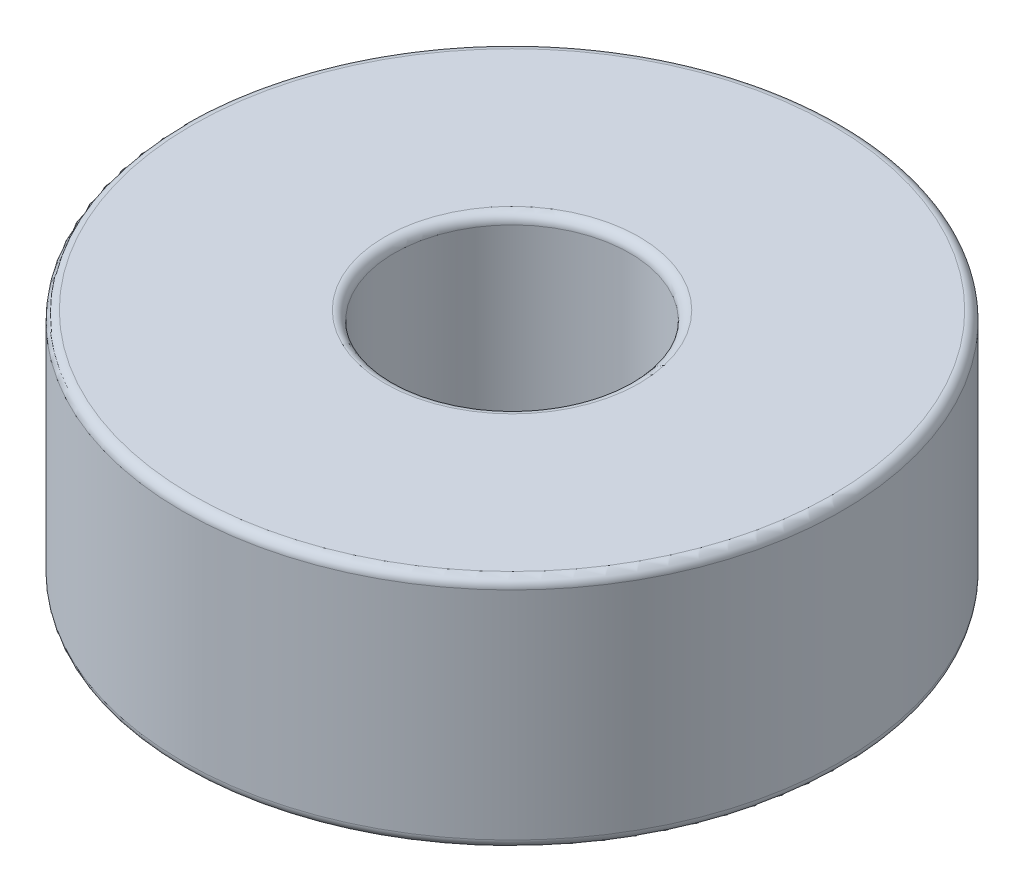
ISO-10303-21;
HEADER;
FILE_DESCRIPTION(('STEP AP214'),'2;1');
FILE_NAME('part.step','',(''),(''),'','','');
FILE_SCHEMA(('AUTOMOTIVE_DESIGN { 1 0 10303 214 1 1 1 1 }'));
ENDSEC;
DATA;
#1=APPLICATION_CONTEXT('core data for automotive mechanical design processes');
#2=APPLICATION_PROTOCOL_DEFINITION('international standard','automotive_design',2000,#1);
#3=PRODUCT_CONTEXT('',#1,'mechanical');
#4=PRODUCT('Part','Part','',(#3));
#5=PRODUCT_RELATED_PRODUCT_CATEGORY('part','',(#4));
#6=PRODUCT_DEFINITION_FORMATION('','',#4);
#7=PRODUCT_DEFINITION_CONTEXT('part definition',#1,'design');
#8=PRODUCT_DEFINITION('design','',#6,#7);
#9=PRODUCT_DEFINITION_SHAPE('','',#8);
#10=(LENGTH_UNIT() NAMED_UNIT(*) SI_UNIT(.MILLI.,.METRE.));
#11=(NAMED_UNIT(*) PLANE_ANGLE_UNIT() SI_UNIT($,.RADIAN.));
#12=(NAMED_UNIT(*) SI_UNIT($,.STERADIAN.) SOLID_ANGLE_UNIT());
#13=UNCERTAINTY_MEASURE_WITH_UNIT(LENGTH_MEASURE(1.E-05),#10,'distance_accuracy_value','');
#14=(GEOMETRIC_REPRESENTATION_CONTEXT(3) GLOBAL_UNCERTAINTY_ASSIGNED_CONTEXT((#13)) GLOBAL_UNIT_ASSIGNED_CONTEXT((#10,
#11,#12)) REPRESENTATION_CONTEXT('',''));
#15=CARTESIAN_POINT('',(0.,0.,0.));
#16=DIRECTION('',(0.,0.,1.));
#17=DIRECTION('',(1.,0.,0.));
#18=AXIS2_PLACEMENT_3D('',#15,#16,#17);
#19=CARTESIAN_POINT('',(0.,2.5,0.));
#20=DIRECTION('',(0.,1.,0.));
#21=DIRECTION('',(0.,0.,1.));
#22=AXIS2_PLACEMENT_3D('',#19,#20,#21);
#23=PLANE('',#22);
#24=CARTESIAN_POINT('',(0.,2.5,0.));
#25=DIRECTION('',(0.,1.,0.));
#26=DIRECTION('',(0.,0.,1.));
#27=AXIS2_PLACEMENT_3D('',#24,#25,#26);
#28=CIRCLE('',#27,2.7);
#29=CARTESIAN_POINT('',(0.,2.5,2.7));
#30=VERTEX_POINT('',#29);
#31=EDGE_CURVE('E10',#30,#30,#28,.F.);
#32=ORIENTED_EDGE('',*,*,#31,.T.);
#33=EDGE_LOOP('',(#32));
#34=FACE_BOUND('',#33,.T.);
#35=CARTESIAN_POINT('',(0.,2.5,0.));
#36=DIRECTION('',(0.,1.,0.));
#37=DIRECTION('',(0.,0.,1.));
#38=AXIS2_PLACEMENT_3D('',#35,#36,#37);
#39=CIRCLE('',#38,6.8);
#40=CARTESIAN_POINT('',(0.,2.5,6.8));
#41=VERTEX_POINT('',#40);
#42=EDGE_CURVE('E45',#41,#41,#39,.T.);
#43=ORIENTED_EDGE('',*,*,#42,.T.);
#44=EDGE_LOOP('',(#43));
#45=FACE_BOUND('',#44,.T.);
#46=ADVANCED_FACE('F37',(#34,#45),#23,.T.);
#47=CARTESIAN_POINT('',(0.,-2.5,0.));
#48=DIRECTION('',(0.,1.,0.));
#49=DIRECTION('',(0.,0.,1.));
#50=AXIS2_PLACEMENT_3D('',#47,#48,#49);
#51=PLANE('',#50);
#52=CARTESIAN_POINT('',(0.,-2.5,0.));
#53=DIRECTION('',(0.,1.,0.));
#54=DIRECTION('',(0.,0.,1.));
#55=AXIS2_PLACEMENT_3D('',#52,#53,#54);
#56=CIRCLE('',#55,2.7);
#57=CARTESIAN_POINT('',(0.,-2.5,2.7));
#58=VERTEX_POINT('',#57);
#59=EDGE_CURVE('E69',#58,#58,#56,.T.);
#60=ORIENTED_EDGE('',*,*,#59,.T.);
#61=EDGE_LOOP('',(#60));
#62=FACE_BOUND('',#61,.T.);
#63=CARTESIAN_POINT('',(0.,-2.5,0.));
#64=DIRECTION('',(0.,1.,0.));
#65=DIRECTION('',(0.,0.,1.));
#66=AXIS2_PLACEMENT_3D('',#63,#64,#65);
#67=CIRCLE('',#66,6.8);
#68=CARTESIAN_POINT('',(0.,-2.5,6.8));
#69=VERTEX_POINT('',#68);
#70=EDGE_CURVE('E73',#69,#69,#67,.F.);
#71=ORIENTED_EDGE('',*,*,#70,.T.);
#72=EDGE_LOOP('',(#71));
#73=FACE_BOUND('',#72,.T.);
#74=ADVANCED_FACE('F78',(#62,#73),#51,.F.);
#75=CARTESIAN_POINT('',(0.,2.5,0.));
#76=DIRECTION('',(0.,-1.,0.));
#77=DIRECTION('',(0.,0.,-1.));
#78=AXIS2_PLACEMENT_3D('',#75,#76,#77);
#79=CYLINDRICAL_SURFACE('',#78,7.);
#80=CARTESIAN_POINT('',(0.,-2.3,0.));
#81=DIRECTION('',(0.,1.,0.));
#82=DIRECTION('',(0.,0.,1.));
#83=AXIS2_PLACEMENT_3D('',#80,#81,#82);
#84=CIRCLE('',#83,7.);
#85=CARTESIAN_POINT('',(0.,-2.3,7.));
#86=VERTEX_POINT('',#85);
#87=EDGE_CURVE('E50',#86,#86,#84,.T.);
#88=ORIENTED_EDGE('',*,*,#87,.T.);
#89=EDGE_LOOP('',(#88));
#90=FACE_BOUND('',#89,.T.);
#91=CARTESIAN_POINT('',(0.,2.3,0.));
#92=DIRECTION('',(0.,1.,0.));
#93=DIRECTION('',(0.,0.,1.));
#94=AXIS2_PLACEMENT_3D('',#91,#92,#93);
#95=CIRCLE('',#94,7.);
#96=CARTESIAN_POINT('',(0.,2.3,7.));
#97=VERTEX_POINT('',#96);
#98=EDGE_CURVE('E55',#97,#97,#95,.F.);
#99=ORIENTED_EDGE('',*,*,#98,.T.);
#100=EDGE_LOOP('',(#99));
#101=FACE_BOUND('',#100,.T.);
#102=ADVANCED_FACE('F88',(#90,#101),#79,.T.);
#103=CARTESIAN_POINT('',(0.,2.5,0.));
#104=DIRECTION('',(0.,-1.,0.));
#105=DIRECTION('',(0.,0.,-1.));
#106=AXIS2_PLACEMENT_3D('',#103,#104,#105);
#107=CYLINDRICAL_SURFACE('',#106,2.5);
#108=CARTESIAN_POINT('',(0.,-2.3,0.));
#109=DIRECTION('',(0.,1.,0.));
#110=DIRECTION('',(0.,0.,1.));
#111=AXIS2_PLACEMENT_3D('',#108,#109,#110);
#112=CIRCLE('',#111,2.5);
#113=CARTESIAN_POINT('',(0.,-2.3,2.5));
#114=VERTEX_POINT('',#113);
#115=EDGE_CURVE('E61',#114,#114,#112,.F.);
#116=ORIENTED_EDGE('',*,*,#115,.T.);
#117=EDGE_LOOP('',(#116));
#118=FACE_BOUND('',#117,.T.);
#119=CARTESIAN_POINT('',(0.,2.3,0.));
#120=DIRECTION('',(0.,1.,0.));
#121=DIRECTION('',(0.,0.,1.));
#122=AXIS2_PLACEMENT_3D('',#119,#120,#121);
#123=CIRCLE('',#122,2.5);
#124=CARTESIAN_POINT('',(0.,2.3,2.5));
#125=VERTEX_POINT('',#124);
#126=EDGE_CURVE('E65',#125,#125,#123,.T.);
#127=ORIENTED_EDGE('',*,*,#126,.T.);
#128=EDGE_LOOP('',(#127));
#129=FACE_BOUND('',#128,.T.);
#130=ADVANCED_FACE('F91',(#118,#129),#107,.F.);
#131=CARTESIAN_POINT('',(0.,-2.3,0.));
#132=DIRECTION('',(0.,1.,0.));
#133=DIRECTION('',(0.,0.,1.));
#134=AXIS2_PLACEMENT_3D('',#131,#132,#133);
#135=TOROIDAL_SURFACE('',#134,2.7,0.2);
#136=ORIENTED_EDGE('',*,*,#115,.F.);
#137=EDGE_LOOP('',(#136));
#138=FACE_BOUND('',#137,.T.);
#139=ORIENTED_EDGE('',*,*,#59,.F.);
#140=EDGE_LOOP('',(#139));
#141=FACE_BOUND('',#140,.T.);
#142=ADVANCED_FACE('F84',(#138,#141),#135,.T.);
#143=CARTESIAN_POINT('',(0.,-2.3,0.));
#144=DIRECTION('',(0.,1.,0.));
#145=DIRECTION('',(0.,0.,1.));
#146=AXIS2_PLACEMENT_3D('',#143,#144,#145);
#147=TOROIDAL_SURFACE('',#146,6.8,0.2);
#148=ORIENTED_EDGE('',*,*,#70,.F.);
#149=EDGE_LOOP('',(#148));
#150=FACE_BOUND('',#149,.T.);
#151=ORIENTED_EDGE('',*,*,#87,.F.);
#152=EDGE_LOOP('',(#151));
#153=FACE_BOUND('',#152,.T.);
#154=ADVANCED_FACE('F80',(#150,#153),#147,.T.);
#155=CARTESIAN_POINT('',(0.,2.3,0.));
#156=DIRECTION('',(0.,1.,0.));
#157=DIRECTION('',(0.,0.,1.));
#158=AXIS2_PLACEMENT_3D('',#155,#156,#157);
#159=TOROIDAL_SURFACE('',#158,2.7,0.2);
#160=ORIENTED_EDGE('',*,*,#31,.F.);
#161=EDGE_LOOP('',(#160));
#162=FACE_BOUND('',#161,.T.);
#163=ORIENTED_EDGE('',*,*,#126,.F.);
#164=EDGE_LOOP('',(#163));
#165=FACE_BOUND('',#164,.T.);
#166=ADVANCED_FACE('F83',(#162,#165),#159,.T.);
#167=CARTESIAN_POINT('',(0.,2.3,0.));
#168=DIRECTION('',(0.,1.,0.));
#169=DIRECTION('',(0.,0.,1.));
#170=AXIS2_PLACEMENT_3D('',#167,#168,#169);
#171=TOROIDAL_SURFACE('',#170,6.8,0.2);
#172=ORIENTED_EDGE('',*,*,#98,.F.);
#173=EDGE_LOOP('',(#172));
#174=FACE_BOUND('',#173,.T.);
#175=ORIENTED_EDGE('',*,*,#42,.F.);
#176=EDGE_LOOP('',(#175));
#177=FACE_BOUND('',#176,.T.);
#178=ADVANCED_FACE('F39',(#174,#177),#171,.T.);
#179=CLOSED_SHELL('',(#46,#74,#102,#130,#142,#154,#166,#178));
#180=MANIFOLD_SOLID_BREP('B2',#179);
#181=ADVANCED_BREP_SHAPE_REPRESENTATION('',(#18,#180),#14);
#182=SHAPE_DEFINITION_REPRESENTATION(#9,#181);
ENDSEC;
END-ISO-10303-21;
